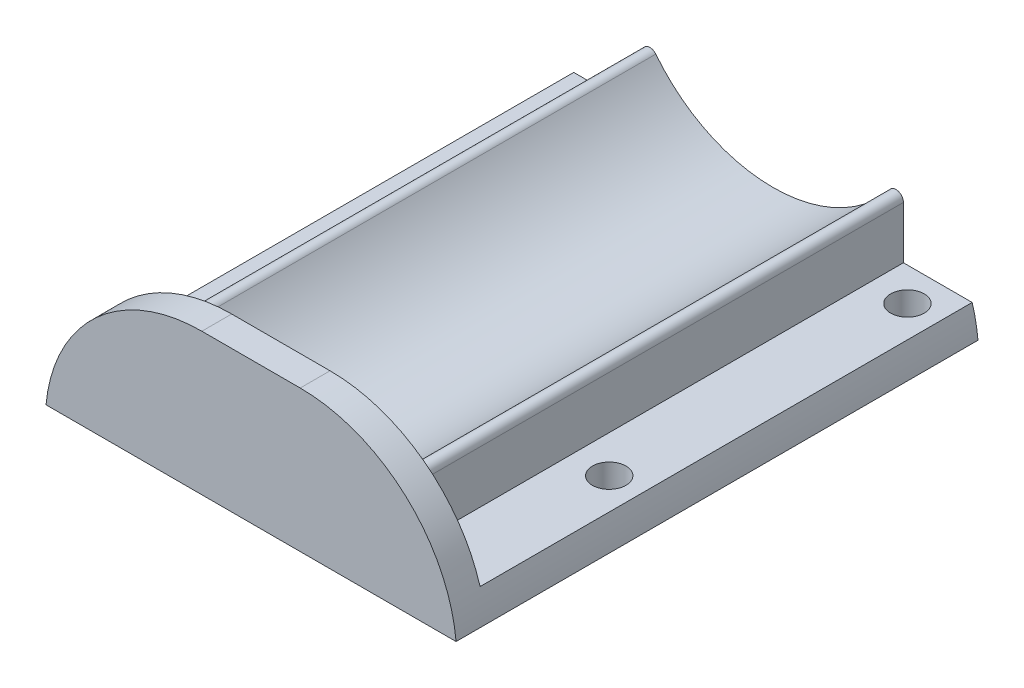
ISO-10303-21;
HEADER;
FILE_DESCRIPTION(('STEP AP214'),'2;1');
FILE_NAME('part.step','',(''),(''),'','','');
FILE_SCHEMA(('AUTOMOTIVE_DESIGN { 1 0 10303 214 1 1 1 1 }'));
ENDSEC;
DATA;
#1=APPLICATION_CONTEXT('core data for automotive mechanical design processes');
#2=APPLICATION_PROTOCOL_DEFINITION('international standard','automotive_design',2000,#1);
#3=PRODUCT_CONTEXT('',#1,'mechanical');
#4=PRODUCT('Part','Part','',(#3));
#5=PRODUCT_RELATED_PRODUCT_CATEGORY('part','',(#4));
#6=PRODUCT_DEFINITION_FORMATION('','',#4);
#7=PRODUCT_DEFINITION_CONTEXT('part definition',#1,'design');
#8=PRODUCT_DEFINITION('design','',#6,#7);
#9=PRODUCT_DEFINITION_SHAPE('','',#8);
#10=(LENGTH_UNIT() NAMED_UNIT(*) SI_UNIT(.MILLI.,.METRE.));
#11=(NAMED_UNIT(*) PLANE_ANGLE_UNIT() SI_UNIT($,.RADIAN.));
#12=(NAMED_UNIT(*) SI_UNIT($,.STERADIAN.) SOLID_ANGLE_UNIT());
#13=UNCERTAINTY_MEASURE_WITH_UNIT(LENGTH_MEASURE(1.E-05),#10,'distance_accuracy_value','');
#14=(GEOMETRIC_REPRESENTATION_CONTEXT(3) GLOBAL_UNCERTAINTY_ASSIGNED_CONTEXT((#13)) GLOBAL_UNIT_ASSIGNED_CONTEXT((#10,
#11,#12)) REPRESENTATION_CONTEXT('',''));
#15=CARTESIAN_POINT('',(0.,0.,0.));
#16=DIRECTION('',(0.,0.,1.));
#17=DIRECTION('',(1.,0.,0.));
#18=AXIS2_PLACEMENT_3D('',#15,#16,#17);
#19=CARTESIAN_POINT('',(0.,4.,0.));
#20=DIRECTION('',(0.,-1.,0.));
#21=DIRECTION('',(0.,0.,-1.));
#22=AXIS2_PLACEMENT_3D('',#19,#20,#21);
#23=PLANE('',#22);
#24=CARTESIAN_POINT('',(22.5,4.,-30.5367353585666));
#25=DIRECTION('',(0.,1.,0.));
#26=DIRECTION('',(0.,0.,1.));
#27=AXIS2_PLACEMENT_3D('',#24,#25,#26);
#28=CIRCLE('',#27,2.25);
#29=CARTESIAN_POINT('',(22.5,4.,-28.2867353585666));
#30=VERTEX_POINT('',#29);
#31=EDGE_CURVE('E190',#30,#30,#28,.T.);
#32=ORIENTED_EDGE('',*,*,#31,.F.);
#33=EDGE_LOOP('',(#32));
#34=FACE_BOUND('',#33,.T.);
#35=CARTESIAN_POINT('',(22.5,4.,9.4632646414334));
#36=DIRECTION('',(0.,1.,0.));
#37=DIRECTION('',(0.,0.,1.));
#38=AXIS2_PLACEMENT_3D('',#35,#36,#37);
#39=CIRCLE('',#38,2.25);
#40=CARTESIAN_POINT('',(22.5,4.,11.7132646414334));
#41=VERTEX_POINT('',#40);
#42=EDGE_CURVE('E206',#41,#41,#39,.T.);
#43=ORIENTED_EDGE('',*,*,#42,.F.);
#44=EDGE_LOOP('',(#43));
#45=FACE_BOUND('',#44,.T.);
#46=DIRECTION('',(-1.,0.,0.));
#47=VECTOR('',#46,1.);
#48=CARTESIAN_POINT('',(-27.5,4.,31.));
#49=LINE('',#48,#47);
#50=CARTESIAN_POINT('',(26.7200668371312,4.,31.));
#51=VERTEX_POINT('',#50);
#52=CARTESIAN_POINT('',(17.5,4.,31.));
#53=VERTEX_POINT('',#52);
#54=EDGE_CURVE('E149',#51,#53,#49,.T.);
#55=ORIENTED_EDGE('',*,*,#54,.F.);
#56=DIRECTION('',(0.,0.,1.));
#57=VECTOR('',#56,1.);
#58=CARTESIAN_POINT('',(26.7200668371312,4.,31.));
#59=LINE('',#58,#57);
#60=CARTESIAN_POINT('',(26.7200668371312,4.,-35.));
#61=VERTEX_POINT('',#60);
#62=EDGE_CURVE('E83',#51,#61,#59,.F.);
#63=ORIENTED_EDGE('',*,*,#62,.T.);
#64=DIRECTION('',(-1.,0.,0.));
#65=VECTOR('',#64,1.);
#66=CARTESIAN_POINT('',(-27.5,4.,-35.));
#67=LINE('',#66,#65);
#68=CARTESIAN_POINT('',(17.5,4.,-35.));
#69=VERTEX_POINT('',#68);
#70=EDGE_CURVE('E173',#61,#69,#67,.T.);
#71=ORIENTED_EDGE('',*,*,#70,.T.);
#72=DIRECTION('',(0.,0.,-1.));
#73=VECTOR('',#72,1.);
#74=CARTESIAN_POINT('',(17.5,4.,35.));
#75=LINE('',#74,#73);
#76=EDGE_CURVE('E165',#53,#69,#75,.T.);
#77=ORIENTED_EDGE('',*,*,#76,.F.);
#78=EDGE_LOOP('',(#55,#63,#71,#77));
#79=FACE_BOUND('',#78,.T.);
#80=ADVANCED_FACE('F59',(#34,#45,#79),#23,.F.);
#81=CARTESIAN_POINT('',(-22.5,4.,9.4632646414334));
#82=DIRECTION('',(0.,1.,0.));
#83=DIRECTION('',(0.,0.,1.));
#84=AXIS2_PLACEMENT_3D('',#81,#82,#83);
#85=CIRCLE('',#84,2.25);
#86=CARTESIAN_POINT('',(-22.5,4.,11.7132646414334));
#87=VERTEX_POINT('',#86);
#88=EDGE_CURVE('E198',#87,#87,#85,.T.);
#89=ORIENTED_EDGE('',*,*,#88,.F.);
#90=EDGE_LOOP('',(#89));
#91=FACE_BOUND('',#90,.T.);
#92=CARTESIAN_POINT('',(-22.5,4.,-30.5367353585666));
#93=DIRECTION('',(0.,1.,0.));
#94=DIRECTION('',(0.,0.,1.));
#95=AXIS2_PLACEMENT_3D('',#92,#93,#94);
#96=CIRCLE('',#95,2.25);
#97=CARTESIAN_POINT('',(-22.5,4.,-28.2867353585666));
#98=VERTEX_POINT('',#97);
#99=EDGE_CURVE('E175',#98,#98,#96,.T.);
#100=ORIENTED_EDGE('',*,*,#99,.F.);
#101=EDGE_LOOP('',(#100));
#102=FACE_BOUND('',#101,.T.);
#103=CARTESIAN_POINT('',(-17.5,4.,-35.));
#104=VERTEX_POINT('',#103);
#105=CARTESIAN_POINT('',(-26.7200668371312,4.,-35.));
#106=VERTEX_POINT('',#105);
#107=EDGE_CURVE('E218',#104,#106,#67,.T.);
#108=ORIENTED_EDGE('',*,*,#107,.T.);
#109=DIRECTION('',(0.,0.,-1.));
#110=VECTOR('',#109,1.);
#111=CARTESIAN_POINT('',(-26.7200668371312,4.,-35.));
#112=LINE('',#111,#110);
#113=CARTESIAN_POINT('',(-26.7200668371312,4.,31.));
#114=VERTEX_POINT('',#113);
#115=EDGE_CURVE('E12',#106,#114,#112,.F.);
#116=ORIENTED_EDGE('',*,*,#115,.T.);
#117=CARTESIAN_POINT('',(-17.5,4.,31.));
#118=VERTEX_POINT('',#117);
#119=EDGE_CURVE('E159',#118,#114,#49,.T.);
#120=ORIENTED_EDGE('',*,*,#119,.F.);
#121=DIRECTION('',(0.,0.,-1.));
#122=VECTOR('',#121,1.);
#123=CARTESIAN_POINT('',(-17.5,4.,35.));
#124=LINE('',#123,#122);
#125=EDGE_CURVE('E170',#118,#104,#124,.T.);
#126=ORIENTED_EDGE('',*,*,#125,.T.);
#127=EDGE_LOOP('',(#108,#116,#120,#126));
#128=FACE_BOUND('',#127,.T.);
#129=ADVANCED_FACE('F312',(#91,#102,#128),#23,.F.);
#130=CARTESIAN_POINT('',(0.,24.,35.));
#131=DIRECTION('',(0.,0.,-1.));
#132=DIRECTION('',(-1.,0.,0.));
#133=AXIS2_PLACEMENT_3D('',#130,#131,#132);
#134=CYLINDRICAL_SURFACE('',#133,20.);
#135=CARTESIAN_POINT('',(0.,24.,31.));
#136=DIRECTION('',(0.,0.,1.));
#137=DIRECTION('',(1.,0.,0.));
#138=AXIS2_PLACEMENT_3D('',#135,#136,#137);
#139=CIRCLE('',#138,20.);
#140=CARTESIAN_POINT('',(15.7142857142857,11.6282085173651,31.));
#141=VERTEX_POINT('',#140);
#142=CARTESIAN_POINT('',(-15.7142857142857,11.6282085173651,31.));
#143=VERTEX_POINT('',#142);
#144=EDGE_CURVE('E171',#141,#143,#139,.F.);
#145=ORIENTED_EDGE('',*,*,#144,.F.);
#146=DIRECTION('',(0.,0.,-1.));
#147=VECTOR('',#146,1.);
#148=CARTESIAN_POINT('',(15.7142857142857,11.6282085173651,35.));
#149=LINE('',#148,#147);
#150=CARTESIAN_POINT('',(15.7142857142857,11.6282085173651,-35.));
#151=VERTEX_POINT('',#150);
#152=EDGE_CURVE('E238',#141,#151,#149,.T.);
#153=ORIENTED_EDGE('',*,*,#152,.T.);
#154=CARTESIAN_POINT('',(0.,24.,-35.));
#155=DIRECTION('',(0.,0.,-1.));
#156=DIRECTION('',(-1.,0.,0.));
#157=AXIS2_PLACEMENT_3D('',#154,#155,#156);
#158=CIRCLE('',#157,20.);
#159=CARTESIAN_POINT('',(-15.7142857142857,11.6282085173651,-35.));
#160=VERTEX_POINT('',#159);
#161=EDGE_CURVE('E183',#151,#160,#158,.T.);
#162=ORIENTED_EDGE('',*,*,#161,.T.);
#163=DIRECTION('',(0.,0.,-1.));
#164=VECTOR('',#163,1.);
#165=CARTESIAN_POINT('',(-15.7142857142857,11.6282085173651,35.));
#166=LINE('',#165,#164);
#167=EDGE_CURVE('E235',#160,#143,#166,.F.);
#168=ORIENTED_EDGE('',*,*,#167,.T.);
#169=EDGE_LOOP('',(#145,#153,#162,#168));
#170=FACE_BOUND('',#169,.T.);
#171=ADVANCED_FACE('F331',(#170),#134,.F.);
#172=CARTESIAN_POINT('',(17.5,0.,35.));
#173=DIRECTION('',(-1.,0.,0.));
#174=DIRECTION('',(0.,0.,1.));
#175=AXIS2_PLACEMENT_3D('',#172,#173,#174);
#176=PLANE('',#175);
#177=DIRECTION('',(0.,1.,0.));
#178=VECTOR('',#177,1.);
#179=CARTESIAN_POINT('',(17.5,0.,-35.));
#180=LINE('',#179,#178);
#181=CARTESIAN_POINT('',(17.5,11.0096189432334,-35.));
#182=VERTEX_POINT('',#181);
#183=EDGE_CURVE('E176',#69,#182,#180,.T.);
#184=ORIENTED_EDGE('',*,*,#183,.T.);
#185=DIRECTION('',(0.,0.,-1.));
#186=VECTOR('',#185,1.);
#187=CARTESIAN_POINT('',(17.5,11.0096189432334,35.));
#188=LINE('',#187,#186);
#189=CARTESIAN_POINT('',(17.5,11.0096189432334,31.));
#190=VERTEX_POINT('',#189);
#191=EDGE_CURVE('E168',#182,#190,#188,.F.);
#192=ORIENTED_EDGE('',*,*,#191,.T.);
#193=DIRECTION('',(0.,1.,0.));
#194=VECTOR('',#193,1.);
#195=CARTESIAN_POINT('',(17.5,0.,31.));
#196=LINE('',#195,#194);
#197=EDGE_CURVE('E153',#53,#190,#196,.T.);
#198=ORIENTED_EDGE('',*,*,#197,.F.);
#199=ORIENTED_EDGE('',*,*,#76,.T.);
#200=EDGE_LOOP('',(#184,#192,#198,#199));
#201=FACE_BOUND('',#200,.T.);
#202=ADVANCED_FACE('F164',(#201),#176,.F.);
#203=CARTESIAN_POINT('',(-17.5,0.,35.));
#204=DIRECTION('',(-1.,0.,0.));
#205=DIRECTION('',(0.,0.,1.));
#206=AXIS2_PLACEMENT_3D('',#203,#204,#205);
#207=PLANE('',#206);
#208=DIRECTION('',(0.,1.,0.));
#209=VECTOR('',#208,1.);
#210=CARTESIAN_POINT('',(-17.5,0.,31.));
#211=LINE('',#210,#209);
#212=CARTESIAN_POINT('',(-17.5,11.0096189432334,31.));
#213=VERTEX_POINT('',#212);
#214=EDGE_CURVE('E217',#118,#213,#211,.T.);
#215=ORIENTED_EDGE('',*,*,#214,.T.);
#216=DIRECTION('',(0.,0.,1.));
#217=VECTOR('',#216,1.);
#218=CARTESIAN_POINT('',(-17.5,11.0096189432334,-35.));
#219=LINE('',#218,#217);
#220=CARTESIAN_POINT('',(-17.5,11.0096189432334,-35.));
#221=VERTEX_POINT('',#220);
#222=EDGE_CURVE('E250',#213,#221,#219,.F.);
#223=ORIENTED_EDGE('',*,*,#222,.T.);
#224=DIRECTION('',(0.,1.,0.));
#225=VECTOR('',#224,1.);
#226=CARTESIAN_POINT('',(-17.5,0.,-35.));
#227=LINE('',#226,#225);
#228=EDGE_CURVE('E322',#104,#221,#227,.T.);
#229=ORIENTED_EDGE('',*,*,#228,.F.);
#230=ORIENTED_EDGE('',*,*,#125,.F.);
#231=EDGE_LOOP('',(#215,#223,#229,#230));
#232=FACE_BOUND('',#231,.T.);
#233=ADVANCED_FACE('F338',(#232),#207,.T.);
#234=CARTESIAN_POINT('',(-27.5,4.,-35.));
#235=DIRECTION('',(0.,0.,1.));
#236=DIRECTION('',(1.,0.,0.));
#237=AXIS2_PLACEMENT_3D('',#234,#235,#236);
#238=PLANE('',#237);
#239=ORIENTED_EDGE('',*,*,#70,.F.);
#240=CARTESIAN_POINT('',(6.59545503963313,-2.,-35.));
#241=DIRECTION('',(0.,0.,1.));
#242=DIRECTION('',(1.,0.,0.));
#243=AXIS2_PLACEMENT_3D('',#240,#241,#242);
#244=CIRCLE('',#243,21.);
#245=CARTESIAN_POINT('',(27.5,0.,-35.));
#246=VERTEX_POINT('',#245);
#247=EDGE_CURVE('E277',#61,#246,#244,.F.);
#248=ORIENTED_EDGE('',*,*,#247,.T.);
#249=DIRECTION('',(-1.,0.,0.));
#250=VECTOR('',#249,1.);
#251=CARTESIAN_POINT('',(-27.5,0.,-35.));
#252=LINE('',#251,#250);
#253=CARTESIAN_POINT('',(-27.5,0.,-35.));
#254=VERTEX_POINT('',#253);
#255=EDGE_CURVE('E222',#246,#254,#252,.T.);
#256=ORIENTED_EDGE('',*,*,#255,.T.);
#257=CARTESIAN_POINT('',(-6.59545503963313,-2.,-35.));
#258=DIRECTION('',(0.,0.,1.));
#259=DIRECTION('',(1.,0.,0.));
#260=AXIS2_PLACEMENT_3D('',#257,#258,#259);
#261=CIRCLE('',#260,21.);
#262=EDGE_CURVE('E75',#254,#106,#261,.F.);
#263=ORIENTED_EDGE('',*,*,#262,.T.);
#264=ORIENTED_EDGE('',*,*,#107,.F.);
#265=ORIENTED_EDGE('',*,*,#228,.T.);
#266=CARTESIAN_POINT('',(-16.5,11.0096189432334,-35.));
#267=DIRECTION('',(0.,0.,1.));
#268=DIRECTION('',(1.,0.,0.));
#269=AXIS2_PLACEMENT_3D('',#266,#267,#268);
#270=CIRCLE('',#269,1.);
#271=EDGE_CURVE('E242',#221,#160,#270,.F.);
#272=ORIENTED_EDGE('',*,*,#271,.T.);
#273=ORIENTED_EDGE('',*,*,#161,.F.);
#274=CARTESIAN_POINT('',(16.5,11.0096189432334,-35.));
#275=DIRECTION('',(0.,0.,1.));
#276=DIRECTION('',(1.,0.,0.));
#277=AXIS2_PLACEMENT_3D('',#274,#275,#276);
#278=CIRCLE('',#277,1.);
#279=EDGE_CURVE('E245',#151,#182,#278,.F.);
#280=ORIENTED_EDGE('',*,*,#279,.T.);
#281=ORIENTED_EDGE('',*,*,#183,.F.);
#282=EDGE_LOOP('',(#239,#248,#256,#263,#264,#265,#272,#273,#280,#281));
#283=FACE_BOUND('',#282,.T.);
#284=ADVANCED_FACE('F302',(#283),#238,.F.);
#285=CARTESIAN_POINT('',(-27.5,4.,35.));
#286=DIRECTION('',(0.,0.,-1.));
#287=DIRECTION('',(-1.,0.,0.));
#288=AXIS2_PLACEMENT_3D('',#285,#286,#287);
#289=PLANE('',#288);
#290=DIRECTION('',(1.,0.,0.));
#291=VECTOR('',#290,1.);
#292=CARTESIAN_POINT('',(-27.5,0.,35.));
#293=LINE('',#292,#291);
#294=CARTESIAN_POINT('',(-27.5,0.,35.));
#295=VERTEX_POINT('',#294);
#296=CARTESIAN_POINT('',(27.5,0.,35.));
#297=VERTEX_POINT('',#296);
#298=EDGE_CURVE('E229',#295,#297,#293,.T.);
#299=ORIENTED_EDGE('',*,*,#298,.T.);
#300=CARTESIAN_POINT('',(6.59545503963313,-2.,35.));
#301=DIRECTION('',(0.,0.,-1.));
#302=DIRECTION('',(-1.,0.,0.));
#303=AXIS2_PLACEMENT_3D('',#300,#301,#302);
#304=CIRCLE('',#303,21.);
#305=CARTESIAN_POINT('',(6.59545503963313,19.,35.));
#306=VERTEX_POINT('',#305);
#307=EDGE_CURVE('E68',#297,#306,#304,.F.);
#308=ORIENTED_EDGE('',*,*,#307,.T.);
#309=DIRECTION('',(1.,0.,0.));
#310=VECTOR('',#309,1.);
#311=CARTESIAN_POINT('',(-27.5,19.,35.));
#312=LINE('',#311,#310);
#313=CARTESIAN_POINT('',(-6.59545503963313,19.,35.));
#314=VERTEX_POINT('',#313);
#315=EDGE_CURVE('E158',#314,#306,#312,.T.);
#316=ORIENTED_EDGE('',*,*,#315,.F.);
#317=CARTESIAN_POINT('',(-6.59545503963313,-2.,35.));
#318=DIRECTION('',(0.,0.,-1.));
#319=DIRECTION('',(-1.,0.,0.));
#320=AXIS2_PLACEMENT_3D('',#317,#318,#319);
#321=CIRCLE('',#320,21.);
#322=EDGE_CURVE('E280',#314,#295,#321,.F.);
#323=ORIENTED_EDGE('',*,*,#322,.T.);
#324=EDGE_LOOP('',(#299,#308,#316,#323));
#325=FACE_BOUND('',#324,.T.);
#326=ADVANCED_FACE('F287',(#325),#289,.F.);
#327=CARTESIAN_POINT('',(0.,0.,0.));
#328=DIRECTION('',(0.,-1.,0.));
#329=DIRECTION('',(0.,0.,-1.));
#330=AXIS2_PLACEMENT_3D('',#327,#328,#329);
#331=PLANE('',#330);
#332=CARTESIAN_POINT('',(-22.5,0.,-30.5367353585666));
#333=DIRECTION('',(0.,1.,0.));
#334=DIRECTION('',(0.,0.,1.));
#335=AXIS2_PLACEMENT_3D('',#332,#333,#334);
#336=CIRCLE('',#335,2.25);
#337=CARTESIAN_POINT('',(-22.5,0.,-28.2867353585666));
#338=VERTEX_POINT('',#337);
#339=EDGE_CURVE('E181',#338,#338,#336,.T.);
#340=ORIENTED_EDGE('',*,*,#339,.T.);
#341=EDGE_LOOP('',(#340));
#342=FACE_BOUND('',#341,.T.);
#343=CARTESIAN_POINT('',(22.5,0.,-30.5367353585666));
#344=DIRECTION('',(0.,1.,0.));
#345=DIRECTION('',(0.,0.,1.));
#346=AXIS2_PLACEMENT_3D('',#343,#344,#345);
#347=CIRCLE('',#346,2.25);
#348=CARTESIAN_POINT('',(22.5,0.,-28.2867353585666));
#349=VERTEX_POINT('',#348);
#350=EDGE_CURVE('E194',#349,#349,#347,.T.);
#351=ORIENTED_EDGE('',*,*,#350,.T.);
#352=EDGE_LOOP('',(#351));
#353=FACE_BOUND('',#352,.T.);
#354=CARTESIAN_POINT('',(-22.5,0.,9.4632646414334));
#355=DIRECTION('',(0.,1.,0.));
#356=DIRECTION('',(0.,0.,1.));
#357=AXIS2_PLACEMENT_3D('',#354,#355,#356);
#358=CIRCLE('',#357,2.25);
#359=CARTESIAN_POINT('',(-22.5,0.,11.7132646414334));
#360=VERTEX_POINT('',#359);
#361=EDGE_CURVE('E202',#360,#360,#358,.T.);
#362=ORIENTED_EDGE('',*,*,#361,.T.);
#363=EDGE_LOOP('',(#362));
#364=FACE_BOUND('',#363,.T.);
#365=CARTESIAN_POINT('',(22.5,0.,9.4632646414334));
#366=DIRECTION('',(0.,1.,0.));
#367=DIRECTION('',(0.,0.,1.));
#368=AXIS2_PLACEMENT_3D('',#365,#366,#367);
#369=CIRCLE('',#368,2.25);
#370=CARTESIAN_POINT('',(22.5,0.,11.7132646414334));
#371=VERTEX_POINT('',#370);
#372=EDGE_CURVE('E210',#371,#371,#369,.T.);
#373=ORIENTED_EDGE('',*,*,#372,.T.);
#374=EDGE_LOOP('',(#373));
#375=FACE_BOUND('',#374,.T.);
#376=DIRECTION('',(0.,0.,-1.));
#377=VECTOR('',#376,1.);
#378=CARTESIAN_POINT('',(27.5,0.,35.));
#379=LINE('',#378,#377);
#380=EDGE_CURVE('E214',#297,#246,#379,.T.);
#381=ORIENTED_EDGE('',*,*,#380,.F.);
#382=ORIENTED_EDGE('',*,*,#298,.F.);
#383=DIRECTION('',(0.,0.,1.));
#384=VECTOR('',#383,1.);
#385=CARTESIAN_POINT('',(-27.5,0.,35.));
#386=LINE('',#385,#384);
#387=EDGE_CURVE('E225',#254,#295,#386,.T.);
#388=ORIENTED_EDGE('',*,*,#387,.F.);
#389=ORIENTED_EDGE('',*,*,#255,.F.);
#390=EDGE_LOOP('',(#381,#382,#388,#389));
#391=FACE_BOUND('',#390,.T.);
#392=ADVANCED_FACE('F305',(#342,#353,#364,#375,#391),#331,.T.);
#393=CARTESIAN_POINT('',(22.5,4.,9.4632646414334));
#394=DIRECTION('',(0.,1.,0.));
#395=DIRECTION('',(0.,0.,1.));
#396=AXIS2_PLACEMENT_3D('',#393,#394,#395);
#397=CYLINDRICAL_SURFACE('',#396,2.25);
#398=ORIENTED_EDGE('',*,*,#372,.F.);
#399=EDGE_LOOP('',(#398));
#400=FACE_BOUND('',#399,.T.);
#401=ORIENTED_EDGE('',*,*,#42,.T.);
#402=EDGE_LOOP('',(#401));
#403=FACE_BOUND('',#402,.T.);
#404=ADVANCED_FACE('F363',(#400,#403),#397,.F.);
#405=CARTESIAN_POINT('',(-22.5,4.,9.4632646414334));
#406=DIRECTION('',(0.,1.,0.));
#407=DIRECTION('',(0.,0.,1.));
#408=AXIS2_PLACEMENT_3D('',#405,#406,#407);
#409=CYLINDRICAL_SURFACE('',#408,2.25);
#410=ORIENTED_EDGE('',*,*,#361,.F.);
#411=EDGE_LOOP('',(#410));
#412=FACE_BOUND('',#411,.T.);
#413=ORIENTED_EDGE('',*,*,#88,.T.);
#414=EDGE_LOOP('',(#413));
#415=FACE_BOUND('',#414,.T.);
#416=ADVANCED_FACE('F465',(#412,#415),#409,.F.);
#417=CARTESIAN_POINT('',(22.5,4.,-30.5367353585666));
#418=DIRECTION('',(0.,1.,0.));
#419=DIRECTION('',(0.,0.,1.));
#420=AXIS2_PLACEMENT_3D('',#417,#418,#419);
#421=CYLINDRICAL_SURFACE('',#420,2.25);
#422=ORIENTED_EDGE('',*,*,#350,.F.);
#423=EDGE_LOOP('',(#422));
#424=FACE_BOUND('',#423,.T.);
#425=ORIENTED_EDGE('',*,*,#31,.T.);
#426=EDGE_LOOP('',(#425));
#427=FACE_BOUND('',#426,.T.);
#428=ADVANCED_FACE('F457',(#424,#427),#421,.F.);
#429=CARTESIAN_POINT('',(-22.5,4.,-30.5367353585666));
#430=DIRECTION('',(0.,1.,0.));
#431=DIRECTION('',(0.,0.,1.));
#432=AXIS2_PLACEMENT_3D('',#429,#430,#431);
#433=CYLINDRICAL_SURFACE('',#432,2.25);
#434=ORIENTED_EDGE('',*,*,#339,.F.);
#435=EDGE_LOOP('',(#434));
#436=FACE_BOUND('',#435,.T.);
#437=ORIENTED_EDGE('',*,*,#99,.T.);
#438=EDGE_LOOP('',(#437));
#439=FACE_BOUND('',#438,.T.);
#440=ADVANCED_FACE('F403',(#436,#439),#433,.F.);
#441=CARTESIAN_POINT('',(-27.5,19.,31.));
#442=DIRECTION('',(0.,0.,1.));
#443=DIRECTION('',(1.,0.,0.));
#444=AXIS2_PLACEMENT_3D('',#441,#442,#443);
#445=PLANE('',#444);
#446=DIRECTION('',(-1.,0.,0.));
#447=VECTOR('',#446,1.);
#448=CARTESIAN_POINT('',(-27.5,19.,31.));
#449=LINE('',#448,#447);
#450=CARTESIAN_POINT('',(6.59545503963313,19.,31.));
#451=VERTEX_POINT('',#450);
#452=CARTESIAN_POINT('',(-6.59545503963313,19.,31.));
#453=VERTEX_POINT('',#452);
#454=EDGE_CURVE('E297',#451,#453,#449,.T.);
#455=ORIENTED_EDGE('',*,*,#454,.F.);
#456=CARTESIAN_POINT('',(6.59545503963313,-2.,31.));
#457=DIRECTION('',(0.,0.,1.));
#458=DIRECTION('',(1.,0.,0.));
#459=AXIS2_PLACEMENT_3D('',#456,#457,#458);
#460=CIRCLE('',#459,21.);
#461=EDGE_CURVE('E155',#451,#51,#460,.F.);
#462=ORIENTED_EDGE('',*,*,#461,.T.);
#463=ORIENTED_EDGE('',*,*,#54,.T.);
#464=ORIENTED_EDGE('',*,*,#197,.T.);
#465=CARTESIAN_POINT('',(16.5,11.0096189432334,31.));
#466=DIRECTION('',(0.,0.,1.));
#467=DIRECTION('',(1.,0.,0.));
#468=AXIS2_PLACEMENT_3D('',#465,#466,#467);
#469=CIRCLE('',#468,1.);
#470=EDGE_CURVE('E254',#190,#141,#469,.T.);
#471=ORIENTED_EDGE('',*,*,#470,.T.);
#472=ORIENTED_EDGE('',*,*,#144,.T.);
#473=CARTESIAN_POINT('',(-16.5,11.0096189432334,31.));
#474=DIRECTION('',(0.,0.,1.));
#475=DIRECTION('',(1.,0.,0.));
#476=AXIS2_PLACEMENT_3D('',#473,#474,#475);
#477=CIRCLE('',#476,1.);
#478=EDGE_CURVE('E257',#143,#213,#477,.T.);
#479=ORIENTED_EDGE('',*,*,#478,.T.);
#480=ORIENTED_EDGE('',*,*,#214,.F.);
#481=ORIENTED_EDGE('',*,*,#119,.T.);
#482=CARTESIAN_POINT('',(-6.59545503963313,-2.,31.));
#483=DIRECTION('',(0.,0.,1.));
#484=DIRECTION('',(1.,0.,0.));
#485=AXIS2_PLACEMENT_3D('',#482,#483,#484);
#486=CIRCLE('',#485,21.);
#487=EDGE_CURVE('E268',#114,#453,#486,.F.);
#488=ORIENTED_EDGE('',*,*,#487,.T.);
#489=EDGE_LOOP('',(#455,#462,#463,#464,#471,#472,#479,#480,#481,#488));
#490=FACE_BOUND('',#489,.T.);
#491=ADVANCED_FACE('F152',(#490),#445,.F.);
#492=CARTESIAN_POINT('',(0.,19.,0.));
#493=DIRECTION('',(0.,-1.,0.));
#494=DIRECTION('',(0.,0.,-1.));
#495=AXIS2_PLACEMENT_3D('',#492,#493,#494);
#496=PLANE('',#495);
#497=ORIENTED_EDGE('',*,*,#315,.T.);
#498=DIRECTION('',(0.,0.,1.));
#499=VECTOR('',#498,1.);
#500=CARTESIAN_POINT('',(6.59545503963313,19.,0.));
#501=LINE('',#500,#499);
#502=EDGE_CURVE('E264',#306,#451,#501,.F.);
#503=ORIENTED_EDGE('',*,*,#502,.T.);
#504=ORIENTED_EDGE('',*,*,#454,.T.);
#505=DIRECTION('',(0.,0.,-1.));
#506=VECTOR('',#505,1.);
#507=CARTESIAN_POINT('',(-6.59545503963313,19.,0.));
#508=LINE('',#507,#506);
#509=EDGE_CURVE('E260',#453,#314,#508,.F.);
#510=ORIENTED_EDGE('',*,*,#509,.T.);
#511=EDGE_LOOP('',(#497,#503,#504,#510));
#512=FACE_BOUND('',#511,.T.);
#513=ADVANCED_FACE('F293',(#512),#496,.F.);
#514=CARTESIAN_POINT('',(16.5,11.0096189432334,35.));
#515=DIRECTION('',(0.,0.,-1.));
#516=DIRECTION('',(-1.,0.,0.));
#517=AXIS2_PLACEMENT_3D('',#514,#515,#516);
#518=CYLINDRICAL_SURFACE('',#517,1.);
#519=ORIENTED_EDGE('',*,*,#470,.F.);
#520=ORIENTED_EDGE('',*,*,#191,.F.);
#521=ORIENTED_EDGE('',*,*,#279,.F.);
#522=ORIENTED_EDGE('',*,*,#152,.F.);
#523=EDGE_LOOP('',(#519,#520,#521,#522));
#524=FACE_BOUND('',#523,.T.);
#525=ADVANCED_FACE('F370',(#524),#518,.T.);
#526=CARTESIAN_POINT('',(-16.5,11.0096189432334,35.));
#527=DIRECTION('',(0.,0.,-1.));
#528=DIRECTION('',(-1.,0.,0.));
#529=AXIS2_PLACEMENT_3D('',#526,#527,#528);
#530=CYLINDRICAL_SURFACE('',#529,1.);
#531=ORIENTED_EDGE('',*,*,#478,.F.);
#532=ORIENTED_EDGE('',*,*,#167,.F.);
#533=ORIENTED_EDGE('',*,*,#271,.F.);
#534=ORIENTED_EDGE('',*,*,#222,.F.);
#535=EDGE_LOOP('',(#531,#532,#533,#534));
#536=FACE_BOUND('',#535,.T.);
#537=ADVANCED_FACE('F335',(#536),#530,.T.);
#538=CARTESIAN_POINT('',(6.59545503963313,-2.,35.));
#539=DIRECTION('',(0.,0.,1.));
#540=DIRECTION('',(1.,0.,0.));
#541=AXIS2_PLACEMENT_3D('',#538,#539,#540);
#542=CYLINDRICAL_SURFACE('',#541,21.);
#543=ORIENTED_EDGE('',*,*,#307,.F.);
#544=ORIENTED_EDGE('',*,*,#380,.T.);
#545=ORIENTED_EDGE('',*,*,#247,.F.);
#546=ORIENTED_EDGE('',*,*,#62,.F.);
#547=ORIENTED_EDGE('',*,*,#461,.F.);
#548=ORIENTED_EDGE('',*,*,#502,.F.);
#549=EDGE_LOOP('',(#543,#544,#545,#546,#547,#548));
#550=FACE_BOUND('',#549,.T.);
#551=ADVANCED_FACE('F299',(#550),#542,.T.);
#552=CARTESIAN_POINT('',(-6.59545503963313,-2.,35.));
#553=DIRECTION('',(0.,0.,-1.));
#554=DIRECTION('',(-1.,0.,0.));
#555=AXIS2_PLACEMENT_3D('',#552,#553,#554);
#556=CYLINDRICAL_SURFACE('',#555,21.);
#557=ORIENTED_EDGE('',*,*,#262,.F.);
#558=ORIENTED_EDGE('',*,*,#387,.T.);
#559=ORIENTED_EDGE('',*,*,#322,.F.);
#560=ORIENTED_EDGE('',*,*,#509,.F.);
#561=ORIENTED_EDGE('',*,*,#487,.F.);
#562=ORIENTED_EDGE('',*,*,#115,.F.);
#563=EDGE_LOOP('',(#557,#558,#559,#560,#561,#562));
#564=FACE_BOUND('',#563,.T.);
#565=ADVANCED_FACE('F61',(#564),#556,.T.);
#566=CLOSED_SHELL('',(#80,#129,#171,#202,#233,#284,#326,#392,#404,#416,#428,#440,#491,#513,#525,
#537,#551,#565));
#567=MANIFOLD_SOLID_BREP('B2',#566);
#568=ADVANCED_BREP_SHAPE_REPRESENTATION('',(#18,#567),#14);
#569=SHAPE_DEFINITION_REPRESENTATION(#9,#568);
ENDSEC;
END-ISO-10303-21;
